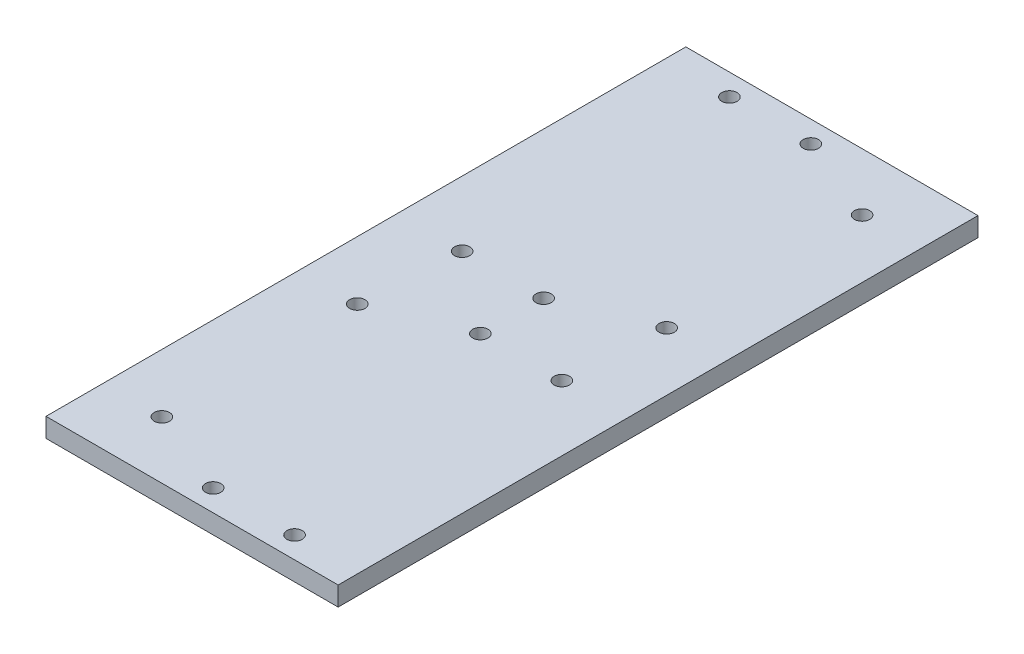
ISO-10303-21;
HEADER;
FILE_DESCRIPTION(('STEP AP214'),'2;1');
FILE_NAME('part.step','',(''),(''),'','','');
FILE_SCHEMA(('AUTOMOTIVE_DESIGN { 1 0 10303 214 1 1 1 1 }'));
ENDSEC;
DATA;
#1=APPLICATION_CONTEXT('core data for automotive mechanical design processes');
#2=APPLICATION_PROTOCOL_DEFINITION('international standard','automotive_design',2000,#1);
#3=PRODUCT_CONTEXT('',#1,'mechanical');
#4=PRODUCT('Part','Part','',(#3));
#5=PRODUCT_RELATED_PRODUCT_CATEGORY('part','',(#4));
#6=PRODUCT_DEFINITION_FORMATION('','',#4);
#7=PRODUCT_DEFINITION_CONTEXT('part definition',#1,'design');
#8=PRODUCT_DEFINITION('design','',#6,#7);
#9=PRODUCT_DEFINITION_SHAPE('','',#8);
#10=(LENGTH_UNIT() NAMED_UNIT(*) SI_UNIT(.MILLI.,.METRE.));
#11=(NAMED_UNIT(*) PLANE_ANGLE_UNIT() SI_UNIT($,.RADIAN.));
#12=(NAMED_UNIT(*) SI_UNIT($,.STERADIAN.) SOLID_ANGLE_UNIT());
#13=UNCERTAINTY_MEASURE_WITH_UNIT(LENGTH_MEASURE(1.E-05),#10,'distance_accuracy_value','');
#14=(GEOMETRIC_REPRESENTATION_CONTEXT(3) GLOBAL_UNCERTAINTY_ASSIGNED_CONTEXT((#13)) GLOBAL_UNIT_ASSIGNED_CONTEXT((#10,
#11,#12)) REPRESENTATION_CONTEXT('',''));
#15=CARTESIAN_POINT('',(0.,0.,0.));
#16=DIRECTION('',(0.,0.,1.));
#17=DIRECTION('',(1.,0.,0.));
#18=AXIS2_PLACEMENT_3D('',#15,#16,#17);
#19=CARTESIAN_POINT('',(0.,2.,0.));
#20=DIRECTION('',(0.,-1.,0.));
#21=DIRECTION('',(0.,0.,-1.));
#22=AXIS2_PLACEMENT_3D('',#19,#20,#21);
#23=PLANE('',#22);
#24=DIRECTION('',(1.,0.,0.));
#25=VECTOR('',#24,1.);
#26=CARTESIAN_POINT('',(0.,2.,0.));
#27=LINE('',#26,#25);
#28=CARTESIAN_POINT('',(0.,2.,0.));
#29=VERTEX_POINT('',#28);
#30=CARTESIAN_POINT('',(30.5,2.,0.));
#31=VERTEX_POINT('',#30);
#32=EDGE_CURVE('E276',#29,#31,#27,.T.);
#33=ORIENTED_EDGE('',*,*,#32,.F.);
#34=DIRECTION('',(0.,0.,1.));
#35=VECTOR('',#34,1.);
#36=CARTESIAN_POINT('',(0.,2.,0.));
#37=LINE('',#36,#35);
#38=CARTESIAN_POINT('',(0.,2.,66.8));
#39=VERTEX_POINT('',#38);
#40=EDGE_CURVE('E266',#29,#39,#37,.T.);
#41=ORIENTED_EDGE('',*,*,#40,.T.);
#42=DIRECTION('',(1.,0.,0.));
#43=VECTOR('',#42,1.);
#44=CARTESIAN_POINT('',(0.,2.,66.8));
#45=LINE('',#44,#43);
#46=CARTESIAN_POINT('',(30.5,2.,66.8));
#47=VERTEX_POINT('',#46);
#48=EDGE_CURVE('E261',#39,#47,#45,.T.);
#49=ORIENTED_EDGE('',*,*,#48,.T.);
#50=DIRECTION('',(0.,0.,1.));
#51=VECTOR('',#50,1.);
#52=CARTESIAN_POINT('',(30.5,2.,0.));
#53=LINE('',#52,#51);
#54=EDGE_CURVE('E265',#31,#47,#53,.T.);
#55=ORIENTED_EDGE('',*,*,#54,.F.);
#56=EDGE_LOOP('',(#33,#41,#49,#55));
#57=FACE_BOUND('',#56,.T.);
#58=CARTESIAN_POINT('',(23.7000000000003,2.,64.5500000000003));
#59=DIRECTION('',(0.,1.,0.));
#60=DIRECTION('',(0.,0.,1.));
#61=AXIS2_PLACEMENT_3D('',#58,#59,#60);
#62=CIRCLE('',#61,0.799999999999998);
#63=CARTESIAN_POINT('',(23.7000000000003,2.,65.3500000000003));
#64=VERTEX_POINT('',#63);
#65=EDGE_CURVE('E286',#64,#64,#62,.T.);
#66=ORIENTED_EDGE('',*,*,#65,.F.);
#67=EDGE_LOOP('',(#66));
#68=FACE_BOUND('',#67,.T.);
#69=CARTESIAN_POINT('',(15.2000000000002,2.,64.5500000000003));
#70=DIRECTION('',(0.,1.,0.));
#71=DIRECTION('',(0.,0.,1.));
#72=AXIS2_PLACEMENT_3D('',#69,#70,#71);
#73=CIRCLE('',#72,0.800000000000001);
#74=CARTESIAN_POINT('',(15.2000000000002,2.,65.3500000000003));
#75=VERTEX_POINT('',#74);
#76=EDGE_CURVE('E329',#75,#75,#73,.T.);
#77=ORIENTED_EDGE('',*,*,#76,.F.);
#78=EDGE_LOOP('',(#77));
#79=FACE_BOUND('',#78,.T.);
#80=CARTESIAN_POINT('',(6.8,2.,2.25000000000017));
#81=DIRECTION('',(0.,1.,0.));
#82=DIRECTION('',(0.,0.,1.));
#83=AXIS2_PLACEMENT_3D('',#80,#81,#82);
#84=CIRCLE('',#83,0.800000000000001);
#85=CARTESIAN_POINT('',(6.8,2.,3.05000000000017));
#86=VERTEX_POINT('',#85);
#87=EDGE_CURVE('E336',#86,#86,#84,.T.);
#88=ORIENTED_EDGE('',*,*,#87,.F.);
#89=EDGE_LOOP('',(#88));
#90=FACE_BOUND('',#89,.T.);
#91=CARTESIAN_POINT('',(15.3000000000001,2.,2.25000000000017));
#92=DIRECTION('',(0.,1.,0.));
#93=DIRECTION('',(0.,0.,1.));
#94=AXIS2_PLACEMENT_3D('',#91,#92,#93);
#95=CIRCLE('',#94,0.799999999999999);
#96=CARTESIAN_POINT('',(15.3000000000001,2.,3.05000000000017));
#97=VERTEX_POINT('',#96);
#98=EDGE_CURVE('E341',#97,#97,#95,.T.);
#99=ORIENTED_EDGE('',*,*,#98,.F.);
#100=EDGE_LOOP('',(#99));
#101=FACE_BOUND('',#100,.T.);
#102=CARTESIAN_POINT('',(6.10000000000028,2.,60.8000000000003));
#103=DIRECTION('',(0.,1.,0.));
#104=DIRECTION('',(0.,0.,1.));
#105=AXIS2_PLACEMENT_3D('',#102,#103,#104);
#106=CIRCLE('',#105,0.799999999999999);
#107=CARTESIAN_POINT('',(6.10000000000028,2.,61.6000000000003));
#108=VERTEX_POINT('',#107);
#109=EDGE_CURVE('E347',#108,#108,#106,.T.);
#110=ORIENTED_EDGE('',*,*,#109,.F.);
#111=EDGE_LOOP('',(#110));
#112=FACE_BOUND('',#111,.T.);
#113=CARTESIAN_POINT('',(6.10000000000028,2.,40.4000000000002));
#114=DIRECTION('',(0.,1.,0.));
#115=DIRECTION('',(0.,0.,1.));
#116=AXIS2_PLACEMENT_3D('',#113,#114,#115);
#117=CIRCLE('',#116,0.799999999999998);
#118=CARTESIAN_POINT('',(6.10000000000028,2.,41.2000000000002));
#119=VERTEX_POINT('',#118);
#120=EDGE_CURVE('E353',#119,#119,#117,.T.);
#121=ORIENTED_EDGE('',*,*,#120,.F.);
#122=EDGE_LOOP('',(#121));
#123=FACE_BOUND('',#122,.T.);
#124=CARTESIAN_POINT('',(15.2000000000002,2.,36.6500000000003));
#125=DIRECTION('',(0.,1.,0.));
#126=DIRECTION('',(0.,0.,1.));
#127=AXIS2_PLACEMENT_3D('',#124,#125,#126);
#128=CIRCLE('',#127,0.799999999999996);
#129=CARTESIAN_POINT('',(15.2000000000002,2.,37.4500000000003));
#130=VERTEX_POINT('',#129);
#131=EDGE_CURVE('E359',#130,#130,#128,.T.);
#132=ORIENTED_EDGE('',*,*,#131,.F.);
#133=EDGE_LOOP('',(#132));
#134=FACE_BOUND('',#133,.T.);
#135=CARTESIAN_POINT('',(23.7000000000003,2.,36.6500000000003));
#136=DIRECTION('',(0.,1.,0.));
#137=DIRECTION('',(0.,0.,1.));
#138=AXIS2_PLACEMENT_3D('',#135,#136,#137);
#139=CIRCLE('',#138,0.8);
#140=CARTESIAN_POINT('',(23.7000000000003,2.,37.4500000000003));
#141=VERTEX_POINT('',#140);
#142=EDGE_CURVE('E365',#141,#141,#139,.T.);
#143=ORIENTED_EDGE('',*,*,#142,.F.);
#144=EDGE_LOOP('',(#143));
#145=FACE_BOUND('',#144,.T.);
#146=CARTESIAN_POINT('',(15.3000000000001,2.,30.1500000000002));
#147=DIRECTION('',(0.,1.,0.));
#148=DIRECTION('',(0.,0.,1.));
#149=AXIS2_PLACEMENT_3D('',#146,#147,#148);
#150=CIRCLE('',#149,0.799999999999995);
#151=CARTESIAN_POINT('',(15.3000000000001,2.,30.9500000000002));
#152=VERTEX_POINT('',#151);
#153=EDGE_CURVE('E371',#152,#152,#150,.T.);
#154=ORIENTED_EDGE('',*,*,#153,.F.);
#155=EDGE_LOOP('',(#154));
#156=FACE_BOUND('',#155,.T.);
#157=CARTESIAN_POINT('',(6.8,2.,30.1500000000002));
#158=DIRECTION('',(0.,1.,0.));
#159=DIRECTION('',(0.,0.,1.));
#160=AXIS2_PLACEMENT_3D('',#157,#158,#159);
#161=CIRCLE('',#160,0.799999999999995);
#162=CARTESIAN_POINT('',(6.8,2.,30.9500000000002));
#163=VERTEX_POINT('',#162);
#164=EDGE_CURVE('E377',#163,#163,#161,.T.);
#165=ORIENTED_EDGE('',*,*,#164,.F.);
#166=EDGE_LOOP('',(#165));
#167=FACE_BOUND('',#166,.T.);
#168=CARTESIAN_POINT('',(24.4,2.,26.4000000000002));
#169=DIRECTION('',(0.,1.,0.));
#170=DIRECTION('',(0.,0.,1.));
#171=AXIS2_PLACEMENT_3D('',#168,#169,#170);
#172=CIRCLE('',#171,0.800000000000003);
#173=CARTESIAN_POINT('',(24.4,2.,27.2000000000002));
#174=VERTEX_POINT('',#173);
#175=EDGE_CURVE('E383',#174,#174,#172,.T.);
#176=ORIENTED_EDGE('',*,*,#175,.F.);
#177=EDGE_LOOP('',(#176));
#178=FACE_BOUND('',#177,.T.);
#179=CARTESIAN_POINT('',(24.4,2.,6.0000000000002));
#180=DIRECTION('',(0.,1.,0.));
#181=DIRECTION('',(0.,0.,1.));
#182=AXIS2_PLACEMENT_3D('',#179,#180,#181);
#183=CIRCLE('',#182,0.800000000000002);
#184=CARTESIAN_POINT('',(24.4,2.,6.8000000000002));
#185=VERTEX_POINT('',#184);
#186=EDGE_CURVE('E389',#185,#185,#183,.T.);
#187=ORIENTED_EDGE('',*,*,#186,.F.);
#188=EDGE_LOOP('',(#187));
#189=FACE_BOUND('',#188,.T.);
#190=ADVANCED_FACE('F215',(#57,#68,#79,#90,#101,#112,#123,#134,#145,#156,#167,#178,#189),#23,.F.);
#191=CARTESIAN_POINT('',(0.,0.,0.));
#192=DIRECTION('',(0.,-1.,0.));
#193=DIRECTION('',(0.,0.,-1.));
#194=AXIS2_PLACEMENT_3D('',#191,#192,#193);
#195=PLANE('',#194);
#196=CARTESIAN_POINT('',(24.4,0.,26.4000000000002));
#197=DIRECTION('',(0.,1.,0.));
#198=DIRECTION('',(0.,0.,1.));
#199=AXIS2_PLACEMENT_3D('',#196,#197,#198);
#200=CIRCLE('',#199,0.800000000000003);
#201=CARTESIAN_POINT('',(24.4,0.,27.2000000000002));
#202=VERTEX_POINT('',#201);
#203=EDGE_CURVE('E386',#202,#202,#200,.T.);
#204=ORIENTED_EDGE('',*,*,#203,.T.);
#205=EDGE_LOOP('',(#204));
#206=FACE_BOUND('',#205,.T.);
#207=CARTESIAN_POINT('',(15.3000000000001,0.,30.1500000000002));
#208=DIRECTION('',(0.,1.,0.));
#209=DIRECTION('',(0.,0.,1.));
#210=AXIS2_PLACEMENT_3D('',#207,#208,#209);
#211=CIRCLE('',#210,0.799999999999995);
#212=CARTESIAN_POINT('',(15.3000000000001,0.,30.9500000000002));
#213=VERTEX_POINT('',#212);
#214=EDGE_CURVE('E374',#213,#213,#211,.T.);
#215=ORIENTED_EDGE('',*,*,#214,.T.);
#216=EDGE_LOOP('',(#215));
#217=FACE_BOUND('',#216,.T.);
#218=CARTESIAN_POINT('',(15.2000000000002,0.,36.6500000000003));
#219=DIRECTION('',(0.,1.,0.));
#220=DIRECTION('',(0.,0.,1.));
#221=AXIS2_PLACEMENT_3D('',#218,#219,#220);
#222=CIRCLE('',#221,0.799999999999996);
#223=CARTESIAN_POINT('',(15.2000000000002,0.,37.4500000000003));
#224=VERTEX_POINT('',#223);
#225=EDGE_CURVE('E362',#224,#224,#222,.T.);
#226=ORIENTED_EDGE('',*,*,#225,.T.);
#227=EDGE_LOOP('',(#226));
#228=FACE_BOUND('',#227,.T.);
#229=CARTESIAN_POINT('',(6.10000000000028,0.,60.8000000000003));
#230=DIRECTION('',(0.,1.,0.));
#231=DIRECTION('',(0.,0.,1.));
#232=AXIS2_PLACEMENT_3D('',#229,#230,#231);
#233=CIRCLE('',#232,0.799999999999999);
#234=CARTESIAN_POINT('',(6.10000000000028,0.,61.6000000000003));
#235=VERTEX_POINT('',#234);
#236=EDGE_CURVE('E350',#235,#235,#233,.T.);
#237=ORIENTED_EDGE('',*,*,#236,.T.);
#238=EDGE_LOOP('',(#237));
#239=FACE_BOUND('',#238,.T.);
#240=CARTESIAN_POINT('',(6.8,0.,2.25000000000017));
#241=DIRECTION('',(0.,1.,0.));
#242=DIRECTION('',(0.,0.,1.));
#243=AXIS2_PLACEMENT_3D('',#240,#241,#242);
#244=CIRCLE('',#243,0.800000000000001);
#245=CARTESIAN_POINT('',(6.8,0.,3.05000000000017));
#246=VERTEX_POINT('',#245);
#247=EDGE_CURVE('E338',#246,#246,#244,.T.);
#248=ORIENTED_EDGE('',*,*,#247,.T.);
#249=EDGE_LOOP('',(#248));
#250=FACE_BOUND('',#249,.T.);
#251=CARTESIAN_POINT('',(23.7000000000003,0.,64.5500000000003));
#252=DIRECTION('',(0.,1.,0.));
#253=DIRECTION('',(0.,0.,1.));
#254=AXIS2_PLACEMENT_3D('',#251,#252,#253);
#255=CIRCLE('',#254,0.799999999999998);
#256=CARTESIAN_POINT('',(23.7000000000003,0.,65.3500000000003));
#257=VERTEX_POINT('',#256);
#258=EDGE_CURVE('E327',#257,#257,#255,.T.);
#259=ORIENTED_EDGE('',*,*,#258,.T.);
#260=EDGE_LOOP('',(#259));
#261=FACE_BOUND('',#260,.T.);
#262=DIRECTION('',(1.,0.,0.));
#263=VECTOR('',#262,1.);
#264=CARTESIAN_POINT('',(0.,0.,0.));
#265=LINE('',#264,#263);
#266=CARTESIAN_POINT('',(0.,0.,0.));
#267=VERTEX_POINT('',#266);
#268=CARTESIAN_POINT('',(30.5,0.,0.));
#269=VERTEX_POINT('',#268);
#270=EDGE_CURVE('E282',#267,#269,#265,.T.);
#271=ORIENTED_EDGE('',*,*,#270,.T.);
#272=DIRECTION('',(0.,0.,1.));
#273=VECTOR('',#272,1.);
#274=CARTESIAN_POINT('',(30.5,0.,0.));
#275=LINE('',#274,#273);
#276=CARTESIAN_POINT('',(30.5,0.,66.8));
#277=VERTEX_POINT('',#276);
#278=EDGE_CURVE('E285',#269,#277,#275,.T.);
#279=ORIENTED_EDGE('',*,*,#278,.T.);
#280=DIRECTION('',(1.,0.,0.));
#281=VECTOR('',#280,1.);
#282=CARTESIAN_POINT('',(0.,0.,66.8));
#283=LINE('',#282,#281);
#284=CARTESIAN_POINT('',(0.,0.,66.8));
#285=VERTEX_POINT('',#284);
#286=EDGE_CURVE('E273',#285,#277,#283,.T.);
#287=ORIENTED_EDGE('',*,*,#286,.F.);
#288=DIRECTION('',(0.,0.,1.));
#289=VECTOR('',#288,1.);
#290=CARTESIAN_POINT('',(0.,0.,0.));
#291=LINE('',#290,#289);
#292=EDGE_CURVE('E249',#267,#285,#291,.T.);
#293=ORIENTED_EDGE('',*,*,#292,.F.);
#294=EDGE_LOOP('',(#271,#279,#287,#293));
#295=FACE_BOUND('',#294,.T.);
#296=CARTESIAN_POINT('',(15.2000000000002,0.,64.5500000000003));
#297=DIRECTION('',(0.,1.,0.));
#298=DIRECTION('',(0.,0.,1.));
#299=AXIS2_PLACEMENT_3D('',#296,#297,#298);
#300=CIRCLE('',#299,0.800000000000001);
#301=CARTESIAN_POINT('',(15.2000000000002,0.,65.3500000000003));
#302=VERTEX_POINT('',#301);
#303=EDGE_CURVE('E332',#302,#302,#300,.T.);
#304=ORIENTED_EDGE('',*,*,#303,.T.);
#305=EDGE_LOOP('',(#304));
#306=FACE_BOUND('',#305,.T.);
#307=CARTESIAN_POINT('',(15.3000000000001,0.,2.25000000000017));
#308=DIRECTION('',(0.,1.,0.));
#309=DIRECTION('',(0.,0.,1.));
#310=AXIS2_PLACEMENT_3D('',#307,#308,#309);
#311=CIRCLE('',#310,0.799999999999999);
#312=CARTESIAN_POINT('',(15.3000000000001,0.,3.05000000000017));
#313=VERTEX_POINT('',#312);
#314=EDGE_CURVE('E344',#313,#313,#311,.T.);
#315=ORIENTED_EDGE('',*,*,#314,.T.);
#316=EDGE_LOOP('',(#315));
#317=FACE_BOUND('',#316,.T.);
#318=CARTESIAN_POINT('',(6.10000000000028,0.,40.4000000000002));
#319=DIRECTION('',(0.,1.,0.));
#320=DIRECTION('',(0.,0.,1.));
#321=AXIS2_PLACEMENT_3D('',#318,#319,#320);
#322=CIRCLE('',#321,0.799999999999998);
#323=CARTESIAN_POINT('',(6.10000000000028,0.,41.2000000000002));
#324=VERTEX_POINT('',#323);
#325=EDGE_CURVE('E356',#324,#324,#322,.T.);
#326=ORIENTED_EDGE('',*,*,#325,.T.);
#327=EDGE_LOOP('',(#326));
#328=FACE_BOUND('',#327,.T.);
#329=CARTESIAN_POINT('',(23.7000000000003,0.,36.6500000000003));
#330=DIRECTION('',(0.,1.,0.));
#331=DIRECTION('',(0.,0.,1.));
#332=AXIS2_PLACEMENT_3D('',#329,#330,#331);
#333=CIRCLE('',#332,0.8);
#334=CARTESIAN_POINT('',(23.7000000000003,0.,37.4500000000003));
#335=VERTEX_POINT('',#334);
#336=EDGE_CURVE('E368',#335,#335,#333,.T.);
#337=ORIENTED_EDGE('',*,*,#336,.T.);
#338=EDGE_LOOP('',(#337));
#339=FACE_BOUND('',#338,.T.);
#340=CARTESIAN_POINT('',(6.8,0.,30.1500000000002));
#341=DIRECTION('',(0.,1.,0.));
#342=DIRECTION('',(0.,0.,1.));
#343=AXIS2_PLACEMENT_3D('',#340,#341,#342);
#344=CIRCLE('',#343,0.799999999999995);
#345=CARTESIAN_POINT('',(6.8,0.,30.9500000000002));
#346=VERTEX_POINT('',#345);
#347=EDGE_CURVE('E380',#346,#346,#344,.T.);
#348=ORIENTED_EDGE('',*,*,#347,.T.);
#349=EDGE_LOOP('',(#348));
#350=FACE_BOUND('',#349,.T.);
#351=CARTESIAN_POINT('',(24.4,0.,6.0000000000002));
#352=DIRECTION('',(0.,1.,0.));
#353=DIRECTION('',(0.,0.,1.));
#354=AXIS2_PLACEMENT_3D('',#351,#352,#353);
#355=CIRCLE('',#354,0.800000000000002);
#356=CARTESIAN_POINT('',(24.4,0.,6.8000000000002));
#357=VERTEX_POINT('',#356);
#358=EDGE_CURVE('E392',#357,#357,#355,.T.);
#359=ORIENTED_EDGE('',*,*,#358,.T.);
#360=EDGE_LOOP('',(#359));
#361=FACE_BOUND('',#360,.T.);
#362=ADVANCED_FACE('F291',(#206,#217,#228,#239,#250,#261,#295,#306,#317,#328,#339,#350,#361),
#195,.T.);
#363=CARTESIAN_POINT('',(0.,2.,0.));
#364=DIRECTION('',(0.,0.,-1.));
#365=DIRECTION('',(-1.,0.,0.));
#366=AXIS2_PLACEMENT_3D('',#363,#364,#365);
#367=PLANE('',#366);
#368=ORIENTED_EDGE('',*,*,#270,.F.);
#369=DIRECTION('',(0.,-1.,0.));
#370=VECTOR('',#369,1.);
#371=CARTESIAN_POINT('',(0.,2.,0.));
#372=LINE('',#371,#370);
#373=EDGE_CURVE('E12',#29,#267,#372,.T.);
#374=ORIENTED_EDGE('',*,*,#373,.F.);
#375=ORIENTED_EDGE('',*,*,#32,.T.);
#376=DIRECTION('',(0.,-1.,0.));
#377=VECTOR('',#376,1.);
#378=CARTESIAN_POINT('',(30.5,2.,0.));
#379=LINE('',#378,#377);
#380=EDGE_CURVE('E219',#31,#269,#379,.T.);
#381=ORIENTED_EDGE('',*,*,#380,.T.);
#382=EDGE_LOOP('',(#368,#374,#375,#381));
#383=FACE_BOUND('',#382,.T.);
#384=ADVANCED_FACE('F217',(#383),#367,.T.);
#385=CARTESIAN_POINT('',(0.,2.,0.));
#386=DIRECTION('',(1.,0.,0.));
#387=DIRECTION('',(0.,0.,-1.));
#388=AXIS2_PLACEMENT_3D('',#385,#386,#387);
#389=PLANE('',#388);
#390=ORIENTED_EDGE('',*,*,#292,.T.);
#391=DIRECTION('',(0.,-1.,0.));
#392=VECTOR('',#391,1.);
#393=CARTESIAN_POINT('',(0.,2.,66.8));
#394=LINE('',#393,#392);
#395=EDGE_CURVE('E225',#39,#285,#394,.T.);
#396=ORIENTED_EDGE('',*,*,#395,.F.);
#397=ORIENTED_EDGE('',*,*,#40,.F.);
#398=ORIENTED_EDGE('',*,*,#373,.T.);
#399=EDGE_LOOP('',(#390,#396,#397,#398));
#400=FACE_BOUND('',#399,.T.);
#401=ADVANCED_FACE('F294',(#400),#389,.F.);
#402=CARTESIAN_POINT('',(0.,2.,66.8));
#403=DIRECTION('',(0.,0.,-1.));
#404=DIRECTION('',(-1.,0.,0.));
#405=AXIS2_PLACEMENT_3D('',#402,#403,#404);
#406=PLANE('',#405);
#407=ORIENTED_EDGE('',*,*,#286,.T.);
#408=DIRECTION('',(0.,-1.,0.));
#409=VECTOR('',#408,1.);
#410=CARTESIAN_POINT('',(30.5,2.,66.8));
#411=LINE('',#410,#409);
#412=EDGE_CURVE('E270',#47,#277,#411,.T.);
#413=ORIENTED_EDGE('',*,*,#412,.F.);
#414=ORIENTED_EDGE('',*,*,#48,.F.);
#415=ORIENTED_EDGE('',*,*,#395,.T.);
#416=EDGE_LOOP('',(#407,#413,#414,#415));
#417=FACE_BOUND('',#416,.T.);
#418=ADVANCED_FACE('F271',(#417),#406,.F.);
#419=CARTESIAN_POINT('',(30.5,2.,0.));
#420=DIRECTION('',(1.,0.,0.));
#421=DIRECTION('',(0.,0.,-1.));
#422=AXIS2_PLACEMENT_3D('',#419,#420,#421);
#423=PLANE('',#422);
#424=ORIENTED_EDGE('',*,*,#278,.F.);
#425=ORIENTED_EDGE('',*,*,#380,.F.);
#426=ORIENTED_EDGE('',*,*,#54,.T.);
#427=ORIENTED_EDGE('',*,*,#412,.T.);
#428=EDGE_LOOP('',(#424,#425,#426,#427));
#429=FACE_BOUND('',#428,.T.);
#430=ADVANCED_FACE('F275',(#429),#423,.T.);
#431=CARTESIAN_POINT('',(23.7000000000003,2.,64.5500000000003));
#432=DIRECTION('',(0.,-1.,0.));
#433=DIRECTION('',(0.,0.,-1.));
#434=AXIS2_PLACEMENT_3D('',#431,#432,#433);
#435=CYLINDRICAL_SURFACE('',#434,0.799999999999998);
#436=ORIENTED_EDGE('',*,*,#65,.T.);
#437=EDGE_LOOP('',(#436));
#438=FACE_BOUND('',#437,.T.);
#439=ORIENTED_EDGE('',*,*,#258,.F.);
#440=EDGE_LOOP('',(#439));
#441=FACE_BOUND('',#440,.T.);
#442=ADVANCED_FACE('F307',(#438,#441),#435,.F.);
#443=CARTESIAN_POINT('',(15.2000000000002,2.,64.5500000000003));
#444=DIRECTION('',(0.,-1.,0.));
#445=DIRECTION('',(0.,0.,-1.));
#446=AXIS2_PLACEMENT_3D('',#443,#444,#445);
#447=CYLINDRICAL_SURFACE('',#446,0.800000000000001);
#448=ORIENTED_EDGE('',*,*,#76,.T.);
#449=EDGE_LOOP('',(#448));
#450=FACE_BOUND('',#449,.T.);
#451=ORIENTED_EDGE('',*,*,#303,.F.);
#452=EDGE_LOOP('',(#451));
#453=FACE_BOUND('',#452,.T.);
#454=ADVANCED_FACE('F315',(#450,#453),#447,.F.);
#455=CARTESIAN_POINT('',(6.8,2.,2.25000000000017));
#456=DIRECTION('',(0.,-1.,0.));
#457=DIRECTION('',(0.,0.,-1.));
#458=AXIS2_PLACEMENT_3D('',#455,#456,#457);
#459=CYLINDRICAL_SURFACE('',#458,0.800000000000001);
#460=ORIENTED_EDGE('',*,*,#87,.T.);
#461=EDGE_LOOP('',(#460));
#462=FACE_BOUND('',#461,.T.);
#463=ORIENTED_EDGE('',*,*,#247,.F.);
#464=EDGE_LOOP('',(#463));
#465=FACE_BOUND('',#464,.T.);
#466=ADVANCED_FACE('F320',(#462,#465),#459,.F.);
#467=CARTESIAN_POINT('',(15.3000000000001,2.,2.25000000000017));
#468=DIRECTION('',(0.,-1.,0.));
#469=DIRECTION('',(0.,0.,-1.));
#470=AXIS2_PLACEMENT_3D('',#467,#468,#469);
#471=CYLINDRICAL_SURFACE('',#470,0.799999999999999);
#472=ORIENTED_EDGE('',*,*,#98,.T.);
#473=EDGE_LOOP('',(#472));
#474=FACE_BOUND('',#473,.T.);
#475=ORIENTED_EDGE('',*,*,#314,.F.);
#476=EDGE_LOOP('',(#475));
#477=FACE_BOUND('',#476,.T.);
#478=ADVANCED_FACE('F435',(#474,#477),#471,.F.);
#479=CARTESIAN_POINT('',(6.10000000000028,2.,60.8000000000003));
#480=DIRECTION('',(0.,-1.,0.));
#481=DIRECTION('',(0.,0.,-1.));
#482=AXIS2_PLACEMENT_3D('',#479,#480,#481);
#483=CYLINDRICAL_SURFACE('',#482,0.799999999999999);
#484=ORIENTED_EDGE('',*,*,#109,.T.);
#485=EDGE_LOOP('',(#484));
#486=FACE_BOUND('',#485,.T.);
#487=ORIENTED_EDGE('',*,*,#236,.F.);
#488=EDGE_LOOP('',(#487));
#489=FACE_BOUND('',#488,.T.);
#490=ADVANCED_FACE('F431',(#486,#489),#483,.F.);
#491=CARTESIAN_POINT('',(6.10000000000028,2.,40.4000000000002));
#492=DIRECTION('',(0.,-1.,0.));
#493=DIRECTION('',(0.,0.,-1.));
#494=AXIS2_PLACEMENT_3D('',#491,#492,#493);
#495=CYLINDRICAL_SURFACE('',#494,0.799999999999998);
#496=ORIENTED_EDGE('',*,*,#120,.T.);
#497=EDGE_LOOP('',(#496));
#498=FACE_BOUND('',#497,.T.);
#499=ORIENTED_EDGE('',*,*,#325,.F.);
#500=EDGE_LOOP('',(#499));
#501=FACE_BOUND('',#500,.T.);
#502=ADVANCED_FACE('F427',(#498,#501),#495,.F.);
#503=CARTESIAN_POINT('',(15.2000000000002,2.,36.6500000000003));
#504=DIRECTION('',(0.,-1.,0.));
#505=DIRECTION('',(0.,0.,-1.));
#506=AXIS2_PLACEMENT_3D('',#503,#504,#505);
#507=CYLINDRICAL_SURFACE('',#506,0.799999999999996);
#508=ORIENTED_EDGE('',*,*,#131,.T.);
#509=EDGE_LOOP('',(#508));
#510=FACE_BOUND('',#509,.T.);
#511=ORIENTED_EDGE('',*,*,#225,.F.);
#512=EDGE_LOOP('',(#511));
#513=FACE_BOUND('',#512,.T.);
#514=ADVANCED_FACE('F423',(#510,#513),#507,.F.);
#515=CARTESIAN_POINT('',(23.7000000000003,2.,36.6500000000003));
#516=DIRECTION('',(0.,-1.,0.));
#517=DIRECTION('',(0.,0.,-1.));
#518=AXIS2_PLACEMENT_3D('',#515,#516,#517);
#519=CYLINDRICAL_SURFACE('',#518,0.8);
#520=ORIENTED_EDGE('',*,*,#142,.T.);
#521=EDGE_LOOP('',(#520));
#522=FACE_BOUND('',#521,.T.);
#523=ORIENTED_EDGE('',*,*,#336,.F.);
#524=EDGE_LOOP('',(#523));
#525=FACE_BOUND('',#524,.T.);
#526=ADVANCED_FACE('F419',(#522,#525),#519,.F.);
#527=CARTESIAN_POINT('',(15.3000000000001,2.,30.1500000000002));
#528=DIRECTION('',(0.,-1.,0.));
#529=DIRECTION('',(0.,0.,-1.));
#530=AXIS2_PLACEMENT_3D('',#527,#528,#529);
#531=CYLINDRICAL_SURFACE('',#530,0.799999999999995);
#532=ORIENTED_EDGE('',*,*,#153,.T.);
#533=EDGE_LOOP('',(#532));
#534=FACE_BOUND('',#533,.T.);
#535=ORIENTED_EDGE('',*,*,#214,.F.);
#536=EDGE_LOOP('',(#535));
#537=FACE_BOUND('',#536,.T.);
#538=ADVANCED_FACE('F415',(#534,#537),#531,.F.);
#539=CARTESIAN_POINT('',(6.8,2.,30.1500000000002));
#540=DIRECTION('',(0.,-1.,0.));
#541=DIRECTION('',(0.,0.,-1.));
#542=AXIS2_PLACEMENT_3D('',#539,#540,#541);
#543=CYLINDRICAL_SURFACE('',#542,0.799999999999995);
#544=ORIENTED_EDGE('',*,*,#164,.T.);
#545=EDGE_LOOP('',(#544));
#546=FACE_BOUND('',#545,.T.);
#547=ORIENTED_EDGE('',*,*,#347,.F.);
#548=EDGE_LOOP('',(#547));
#549=FACE_BOUND('',#548,.T.);
#550=ADVANCED_FACE('F409',(#546,#549),#543,.F.);
#551=CARTESIAN_POINT('',(24.4,2.,26.4000000000002));
#552=DIRECTION('',(0.,-1.,0.));
#553=DIRECTION('',(0.,0.,-1.));
#554=AXIS2_PLACEMENT_3D('',#551,#552,#553);
#555=CYLINDRICAL_SURFACE('',#554,0.800000000000003);
#556=ORIENTED_EDGE('',*,*,#175,.T.);
#557=EDGE_LOOP('',(#556));
#558=FACE_BOUND('',#557,.T.);
#559=ORIENTED_EDGE('',*,*,#203,.F.);
#560=EDGE_LOOP('',(#559));
#561=FACE_BOUND('',#560,.T.);
#562=ADVANCED_FACE('F402',(#558,#561),#555,.F.);
#563=CARTESIAN_POINT('',(24.4,2.,6.0000000000002));
#564=DIRECTION('',(0.,-1.,0.));
#565=DIRECTION('',(0.,0.,-1.));
#566=AXIS2_PLACEMENT_3D('',#563,#564,#565);
#567=CYLINDRICAL_SURFACE('',#566,0.800000000000002);
#568=ORIENTED_EDGE('',*,*,#186,.T.);
#569=EDGE_LOOP('',(#568));
#570=FACE_BOUND('',#569,.T.);
#571=ORIENTED_EDGE('',*,*,#358,.F.);
#572=EDGE_LOOP('',(#571));
#573=FACE_BOUND('',#572,.T.);
#574=ADVANCED_FACE('F398',(#570,#573),#567,.F.);
#575=CLOSED_SHELL('',(#190,#362,#384,#401,#418,#430,#442,#454,#466,#478,#490,#502,#514,#526,
#538,#550,#562,#574));
#576=MANIFOLD_SOLID_BREP('B2',#575);
#577=ADVANCED_BREP_SHAPE_REPRESENTATION('',(#18,#576),#14);
#578=SHAPE_DEFINITION_REPRESENTATION(#9,#577);
ENDSEC;
END-ISO-10303-21;
